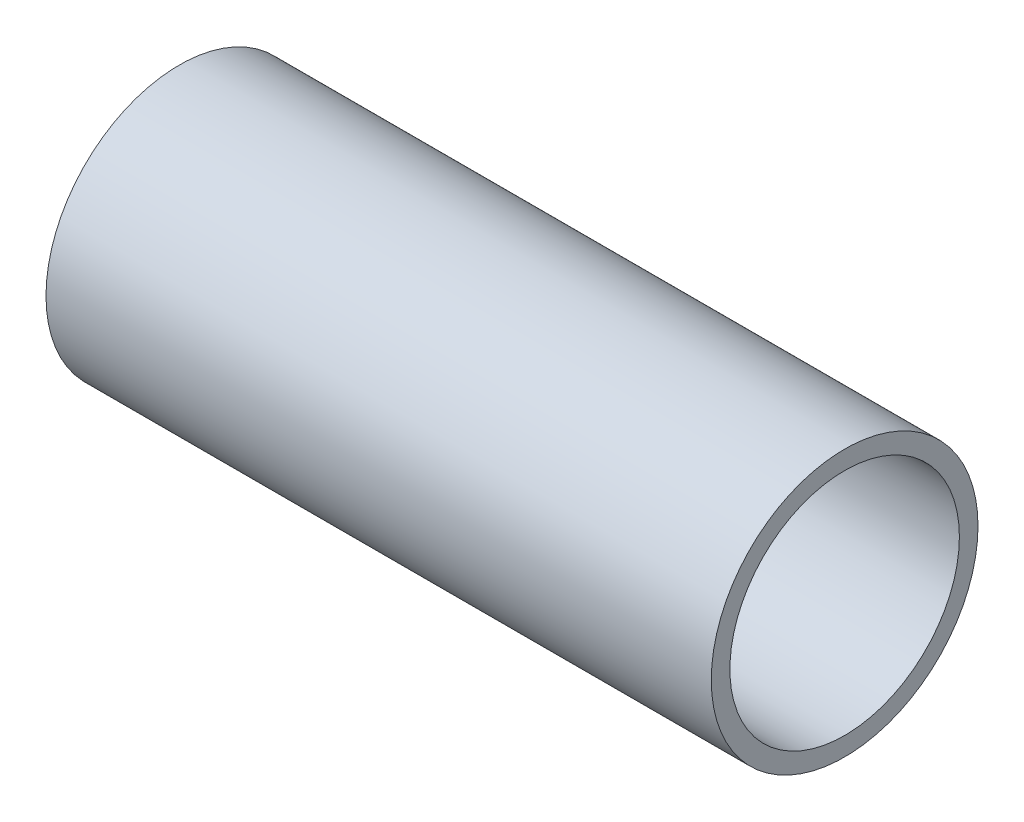
ISO-10303-21;
HEADER;
FILE_DESCRIPTION(('STEP AP214'),'2;1');
FILE_NAME('part.step','',(''),(''),'','','');
FILE_SCHEMA(('AUTOMOTIVE_DESIGN { 1 0 10303 214 1 1 1 1 }'));
ENDSEC;
DATA;
#1=APPLICATION_CONTEXT('core data for automotive mechanical design processes');
#2=APPLICATION_PROTOCOL_DEFINITION('international standard','automotive_design',2000,#1);
#3=PRODUCT_CONTEXT('',#1,'mechanical');
#4=PRODUCT('Part','Part','',(#3));
#5=PRODUCT_RELATED_PRODUCT_CATEGORY('part','',(#4));
#6=PRODUCT_DEFINITION_FORMATION('','',#4);
#7=PRODUCT_DEFINITION_CONTEXT('part definition',#1,'design');
#8=PRODUCT_DEFINITION('design','',#6,#7);
#9=PRODUCT_DEFINITION_SHAPE('','',#8);
#10=(LENGTH_UNIT() NAMED_UNIT(*) SI_UNIT(.MILLI.,.METRE.));
#11=(NAMED_UNIT(*) PLANE_ANGLE_UNIT() SI_UNIT($,.RADIAN.));
#12=(NAMED_UNIT(*) SI_UNIT($,.STERADIAN.) SOLID_ANGLE_UNIT());
#13=UNCERTAINTY_MEASURE_WITH_UNIT(LENGTH_MEASURE(1.E-05),#10,'distance_accuracy_value','');
#14=(GEOMETRIC_REPRESENTATION_CONTEXT(3) GLOBAL_UNCERTAINTY_ASSIGNED_CONTEXT((#13)) GLOBAL_UNIT_ASSIGNED_CONTEXT((#10,
#11,#12)) REPRESENTATION_CONTEXT('',''));
#15=CARTESIAN_POINT('',(0.,0.,0.));
#16=DIRECTION('',(0.,0.,1.));
#17=DIRECTION('',(1.,0.,0.));
#18=AXIS2_PLACEMENT_3D('',#15,#16,#17);
#19=CARTESIAN_POINT('',(0.,0.,0.));
#20=DIRECTION('',(-1.,0.,0.));
#21=DIRECTION('',(0.,0.,1.));
#22=AXIS2_PLACEMENT_3D('',#19,#20,#21);
#23=PLANE('',#22);
#24=CARTESIAN_POINT('',(0.,0.,0.));
#25=DIRECTION('',(1.,0.,0.));
#26=DIRECTION('',(0.,0.,-1.));
#27=AXIS2_PLACEMENT_3D('',#24,#25,#26);
#28=CIRCLE('',#27,37.);
#29=CARTESIAN_POINT('',(0.,0.,-37.));
#30=VERTEX_POINT('',#29);
#31=EDGE_CURVE('E49',#30,#30,#28,.T.);
#32=ORIENTED_EDGE('',*,*,#31,.F.);
#33=EDGE_LOOP('',(#32));
#34=FACE_BOUND('',#33,.T.);
#35=CARTESIAN_POINT('',(0.,0.,0.));
#36=DIRECTION('',(1.,0.,0.));
#37=DIRECTION('',(0.,0.,-1.));
#38=AXIS2_PLACEMENT_3D('',#35,#36,#37);
#39=CIRCLE('',#38,43.);
#40=CARTESIAN_POINT('',(0.,0.,-43.));
#41=VERTEX_POINT('',#40);
#42=EDGE_CURVE('E10',#41,#41,#39,.T.);
#43=ORIENTED_EDGE('',*,*,#42,.T.);
#44=EDGE_LOOP('',(#43));
#45=FACE_BOUND('',#44,.T.);
#46=ADVANCED_FACE('F35',(#34,#45),#23,.F.);
#47=CARTESIAN_POINT('',(0.,0.,0.));
#48=DIRECTION('',(1.,0.,0.));
#49=DIRECTION('',(0.,0.,-1.));
#50=AXIS2_PLACEMENT_3D('',#47,#48,#49);
#51=CYLINDRICAL_SURFACE('',#50,43.);
#52=ORIENTED_EDGE('',*,*,#42,.F.);
#53=EDGE_LOOP('',(#52));
#54=FACE_BOUND('',#53,.T.);
#55=CARTESIAN_POINT('',(-214.5,0.,0.));
#56=DIRECTION('',(1.,0.,0.));
#57=DIRECTION('',(0.,0.,-1.));
#58=AXIS2_PLACEMENT_3D('',#55,#56,#57);
#59=CIRCLE('',#58,43.);
#60=CARTESIAN_POINT('',(-214.5,0.,-43.));
#61=VERTEX_POINT('',#60);
#62=EDGE_CURVE('E41',#61,#61,#59,.T.);
#63=ORIENTED_EDGE('',*,*,#62,.T.);
#64=EDGE_LOOP('',(#63));
#65=FACE_BOUND('',#64,.T.);
#66=ADVANCED_FACE('F59',(#54,#65),#51,.T.);
#67=CARTESIAN_POINT('',(-214.5,0.,0.));
#68=DIRECTION('',(1.,0.,0.));
#69=DIRECTION('',(0.,0.,-1.));
#70=AXIS2_PLACEMENT_3D('',#67,#68,#69);
#71=PLANE('',#70);
#72=ORIENTED_EDGE('',*,*,#62,.F.);
#73=EDGE_LOOP('',(#72));
#74=FACE_BOUND('',#73,.T.);
#75=CARTESIAN_POINT('',(-214.5,0.,0.));
#76=DIRECTION('',(1.,0.,0.));
#77=DIRECTION('',(0.,0.,-1.));
#78=AXIS2_PLACEMENT_3D('',#75,#76,#77);
#79=CIRCLE('',#78,37.);
#80=CARTESIAN_POINT('',(-214.5,0.,-37.));
#81=VERTEX_POINT('',#80);
#82=EDGE_CURVE('E45',#81,#81,#79,.T.);
#83=ORIENTED_EDGE('',*,*,#82,.T.);
#84=EDGE_LOOP('',(#83));
#85=FACE_BOUND('',#84,.T.);
#86=ADVANCED_FACE('F63',(#74,#85),#71,.F.);
#87=CARTESIAN_POINT('',(0.,0.,0.));
#88=DIRECTION('',(1.,0.,0.));
#89=DIRECTION('',(0.,0.,-1.));
#90=AXIS2_PLACEMENT_3D('',#87,#88,#89);
#91=CYLINDRICAL_SURFACE('',#90,37.);
#92=ORIENTED_EDGE('',*,*,#31,.T.);
#93=EDGE_LOOP('',(#92));
#94=FACE_BOUND('',#93,.T.);
#95=ORIENTED_EDGE('',*,*,#82,.F.);
#96=EDGE_LOOP('',(#95));
#97=FACE_BOUND('',#96,.T.);
#98=ADVANCED_FACE('F55',(#94,#97),#91,.F.);
#99=CLOSED_SHELL('',(#46,#66,#86,#98));
#100=MANIFOLD_SOLID_BREP('B2',#99);
#101=ADVANCED_BREP_SHAPE_REPRESENTATION('',(#18,#100),#14);
#102=SHAPE_DEFINITION_REPRESENTATION(#9,#101);
ENDSEC;
END-ISO-10303-21;
